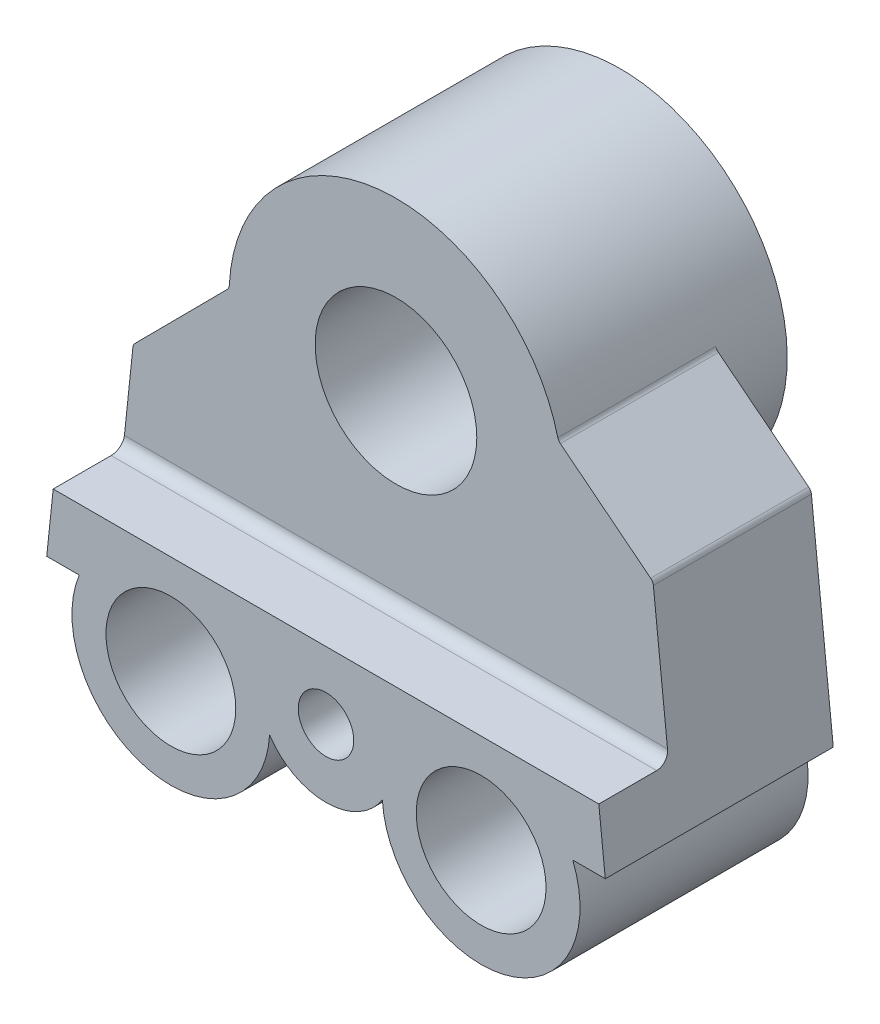
ISO-10303-21;
HEADER;
FILE_DESCRIPTION(('STEP AP214'),'2;1');
FILE_NAME('part.step','',(''),(''),'','','');
FILE_SCHEMA(('AUTOMOTIVE_DESIGN { 1 0 10303 214 1 1 1 1 }'));
ENDSEC;
DATA;
#1=APPLICATION_CONTEXT('core data for automotive mechanical design processes');
#2=APPLICATION_PROTOCOL_DEFINITION('international standard','automotive_design',2000,#1);
#3=PRODUCT_CONTEXT('',#1,'mechanical');
#4=PRODUCT('Part','Part','',(#3));
#5=PRODUCT_RELATED_PRODUCT_CATEGORY('part','',(#4));
#6=PRODUCT_DEFINITION_FORMATION('','',#4);
#7=PRODUCT_DEFINITION_CONTEXT('part definition',#1,'design');
#8=PRODUCT_DEFINITION('design','',#6,#7);
#9=PRODUCT_DEFINITION_SHAPE('','',#8);
#10=(LENGTH_UNIT() NAMED_UNIT(*) SI_UNIT(.MILLI.,.METRE.));
#11=(NAMED_UNIT(*) PLANE_ANGLE_UNIT() SI_UNIT($,.RADIAN.));
#12=(NAMED_UNIT(*) SI_UNIT($,.STERADIAN.) SOLID_ANGLE_UNIT());
#13=UNCERTAINTY_MEASURE_WITH_UNIT(LENGTH_MEASURE(1.E-05),#10,'distance_accuracy_value','');
#14=(GEOMETRIC_REPRESENTATION_CONTEXT(3) GLOBAL_UNCERTAINTY_ASSIGNED_CONTEXT((#13)) GLOBAL_UNIT_ASSIGNED_CONTEXT((#10,
#11,#12)) REPRESENTATION_CONTEXT('',''));
#15=CARTESIAN_POINT('',(0.,0.,0.));
#16=DIRECTION('',(0.,0.,1.));
#17=DIRECTION('',(1.,0.,0.));
#18=AXIS2_PLACEMENT_3D('',#15,#16,#17);
#19=CARTESIAN_POINT('',(0.,0.,-5.5));
#20=DIRECTION('',(0.,0.,1.));
#21=DIRECTION('',(1.,0.,0.));
#22=AXIS2_PLACEMENT_3D('',#19,#20,#21);
#23=CYLINDRICAL_SURFACE('',#22,6.915);
#24=CARTESIAN_POINT('',(0.,0.,-2.75));
#25=DIRECTION('',(0.,0.,1.));
#26=DIRECTION('',(-1.,0.,0.));
#27=AXIS2_PLACEMENT_3D('',#24,#25,#26);
#28=CIRCLE('',#27,6.915);
#29=CARTESIAN_POINT('',(5.31157211435845,-4.42768863787526,-2.75));
#30=VERTEX_POINT('',#29);
#31=CARTESIAN_POINT('',(6.70883660563324,1.67592851843848,-2.75));
#32=VERTEX_POINT('',#31);
#33=EDGE_CURVE('E285',#30,#32,#28,.T.);
#34=ORIENTED_EDGE('',*,*,#33,.F.);
#35=DIRECTION('',(0.,0.,1.));
#36=VECTOR('',#35,1.);
#37=CARTESIAN_POINT('',(5.31157211435845,-4.42768863787526,-5.5));
#38=LINE('',#37,#36);
#39=CARTESIAN_POINT('',(5.31157211435845,-4.42768863787526,-5.5));
#40=VERTEX_POINT('',#39);
#41=EDGE_CURVE('E212',#40,#30,#38,.T.);
#42=ORIENTED_EDGE('',*,*,#41,.F.);
#43=CARTESIAN_POINT('',(0.,0.,-5.5));
#44=DIRECTION('',(0.,0.,1.));
#45=DIRECTION('',(1.,0.,0.));
#46=AXIS2_PLACEMENT_3D('',#43,#44,#45);
#47=CIRCLE('',#46,6.915);
#48=CARTESIAN_POINT('',(-5.31157211435845,-4.42768863787527,-5.5));
#49=VERTEX_POINT('',#48);
#50=EDGE_CURVE('E374',#40,#49,#47,.T.);
#51=ORIENTED_EDGE('',*,*,#50,.T.);
#52=DIRECTION('',(0.,0.,1.));
#53=VECTOR('',#52,1.);
#54=CARTESIAN_POINT('',(-5.31157211435845,-4.42768863787527,-5.5));
#55=LINE('',#54,#53);
#56=CARTESIAN_POINT('',(-5.31157211435845,-4.42768863787527,-2.75));
#57=VERTEX_POINT('',#56);
#58=EDGE_CURVE('E239',#49,#57,#55,.T.);
#59=ORIENTED_EDGE('',*,*,#58,.T.);
#60=CARTESIAN_POINT('',(-6.90652767618571,0.342199441964404,-2.75));
#61=VERTEX_POINT('',#60);
#62=EDGE_CURVE('E286',#61,#57,#28,.T.);
#63=ORIENTED_EDGE('',*,*,#62,.F.);
#64=DIRECTION('',(0.,0.,1.));
#65=VECTOR('',#64,1.);
#66=CARTESIAN_POINT('',(-6.90652767618571,0.342199441964404,-5.5));
#67=LINE('',#66,#65);
#68=CARTESIAN_POINT('',(-6.90652767618571,0.342199441964404,3.8));
#69=VERTEX_POINT('',#68);
#70=EDGE_CURVE('E463',#61,#69,#67,.T.);
#71=ORIENTED_EDGE('',*,*,#70,.T.);
#72=CARTESIAN_POINT('',(0.,0.,3.8));
#73=DIRECTION('',(0.,0.,1.));
#74=DIRECTION('',(1.,0.,0.));
#75=AXIS2_PLACEMENT_3D('',#72,#73,#74);
#76=CIRCLE('',#75,6.915);
#77=CARTESIAN_POINT('',(6.70883660563324,1.67592851843848,3.8));
#78=VERTEX_POINT('',#77);
#79=EDGE_CURVE('E316',#78,#69,#76,.T.);
#80=ORIENTED_EDGE('',*,*,#79,.F.);
#81=DIRECTION('',(0.,0.,1.));
#82=VECTOR('',#81,1.);
#83=CARTESIAN_POINT('',(6.70883660563324,1.67592851843848,-5.5));
#84=LINE('',#83,#82);
#85=EDGE_CURVE('E440',#78,#32,#84,.F.);
#86=ORIENTED_EDGE('',*,*,#85,.T.);
#87=EDGE_LOOP('',(#34,#42,#51,#59,#63,#71,#80,#86));
#88=FACE_BOUND('',#87,.T.);
#89=ADVANCED_FACE('F39',(#88),#23,.T.);
#90=CARTESIAN_POINT('',(-4.42768863787527,-5.31157211435844,-5.5));
#91=VERTEX_POINT('',#90);
#92=CARTESIAN_POINT('',(4.42768863787527,-5.31157211435844,-5.5));
#93=VERTEX_POINT('',#92);
#94=EDGE_CURVE('E375',#91,#93,#47,.T.);
#95=ORIENTED_EDGE('',*,*,#94,.T.);
#96=DIRECTION('',(0.,0.,1.));
#97=VECTOR('',#96,1.);
#98=CARTESIAN_POINT('',(4.42768863787527,-5.31157211435844,-5.5));
#99=LINE('',#98,#97);
#100=CARTESIAN_POINT('',(4.42768863787527,-5.31157211435844,-2.75));
#101=VERTEX_POINT('',#100);
#102=EDGE_CURVE('E224',#93,#101,#99,.T.);
#103=ORIENTED_EDGE('',*,*,#102,.T.);
#104=CARTESIAN_POINT('',(-4.42768863787527,-5.31157211435845,-2.75));
#105=VERTEX_POINT('',#104);
#106=EDGE_CURVE('E291',#105,#101,#28,.T.);
#107=ORIENTED_EDGE('',*,*,#106,.F.);
#108=DIRECTION('',(0.,0.,1.));
#109=VECTOR('',#108,1.);
#110=CARTESIAN_POINT('',(-4.42768863787527,-5.31157211435845,-5.5));
#111=LINE('',#110,#109);
#112=EDGE_CURVE('E243',#91,#105,#111,.T.);
#113=ORIENTED_EDGE('',*,*,#112,.F.);
#114=EDGE_LOOP('',(#95,#103,#107,#113));
#115=FACE_BOUND('',#114,.T.);
#116=ADVANCED_FACE('F562',(#115),#23,.T.);
#117=CARTESIAN_POINT('',(0.,0.,-2.75));
#118=DIRECTION('',(0.,0.,-1.));
#119=DIRECTION('',(-1.,0.,0.));
#120=AXIS2_PLACEMENT_3D('',#117,#118,#119);
#121=PLANE('',#120);
#122=CARTESIAN_POINT('',(0.,-10.525,-2.75));
#123=DIRECTION('',(0.,0.,-1.));
#124=DIRECTION('',(-1.,0.,0.));
#125=AXIS2_PLACEMENT_3D('',#122,#123,#124);
#126=CIRCLE('',#125,1.15);
#127=CARTESIAN_POINT('',(-1.15,-10.525,-2.75));
#128=VERTEX_POINT('',#127);
#129=EDGE_CURVE('E297',#128,#128,#126,.F.);
#130=ORIENTED_EDGE('',*,*,#129,.T.);
#131=EDGE_LOOP('',(#130));
#132=FACE_BOUND('',#131,.T.);
#133=CARTESIAN_POINT('',(6.43,-11.825,-2.75));
#134=DIRECTION('',(0.,0.,-1.));
#135=DIRECTION('',(-1.,0.,0.));
#136=AXIS2_PLACEMENT_3D('',#133,#134,#135);
#137=CIRCLE('',#136,1.325);
#138=CARTESIAN_POINT('',(5.105,-11.825,-2.75));
#139=VERTEX_POINT('',#138);
#140=EDGE_CURVE('E251',#139,#139,#137,.T.);
#141=ORIENTED_EDGE('',*,*,#140,.F.);
#142=EDGE_LOOP('',(#141));
#143=FACE_BOUND('',#142,.T.);
#144=CARTESIAN_POINT('',(-6.43,-11.825,-2.75));
#145=DIRECTION('',(0.,0.,-1.));
#146=DIRECTION('',(-1.,0.,0.));
#147=AXIS2_PLACEMENT_3D('',#144,#145,#146);
#148=CIRCLE('',#147,1.325);
#149=CARTESIAN_POINT('',(-7.755,-11.825,-2.75));
#150=VERTEX_POINT('',#149);
#151=EDGE_CURVE('E246',#150,#150,#148,.T.);
#152=ORIENTED_EDGE('',*,*,#151,.F.);
#153=EDGE_LOOP('',(#152));
#154=FACE_BOUND('',#153,.T.);
#155=DIRECTION('',(-0.707106781186547,-0.707106781186547,0.));
#156=VECTOR('',#155,1.);
#157=CARTESIAN_POINT('',(7.71807051665117,-7.71807051665117,-2.75));
#158=LINE('',#157,#156);
#159=CARTESIAN_POINT('',(8.16001225489276,-7.27612877840957,-2.75));
#160=VERTEX_POINT('',#159);
#161=CARTESIAN_POINT('',(7.27612877840957,-8.16001225489276,-2.75));
#162=VERTEX_POINT('',#161);
#163=EDGE_CURVE('E55',#160,#162,#158,.T.);
#164=ORIENTED_EDGE('',*,*,#163,.F.);
#165=DIRECTION('',(0.707106781186547,-0.707106781186548,0.));
#166=VECTOR('',#165,1.);
#167=CARTESIAN_POINT('',(8.16001225489276,-7.27612877840957,-2.75));
#168=LINE('',#167,#166);
#169=EDGE_CURVE('E62',#30,#160,#168,.T.);
#170=ORIENTED_EDGE('',*,*,#169,.F.);
#171=ORIENTED_EDGE('',*,*,#33,.T.);
#172=CARTESIAN_POINT('',(6.99989242366506,1.74863691403234,-2.75));
#173=DIRECTION('',(0.,0.,-1.));
#174=DIRECTION('',(-1.,0.,0.));
#175=AXIS2_PLACEMENT_3D('',#172,#173,#174);
#176=CIRCLE('',#175,0.3);
#177=CARTESIAN_POINT('',(6.81385226251482,1.51328811238,-2.75));
#178=VERTEX_POINT('',#177);
#179=EDGE_CURVE('E447',#32,#178,#176,.F.);
#180=ORIENTED_EDGE('',*,*,#179,.T.);
#181=DIRECTION('',(0.784496005507815,-0.620133870500783,0.));
#182=VECTOR('',#181,1.);
#183=CARTESIAN_POINT('',(10.6551495232446,-1.5232073207592,-2.75));
#184=LINE('',#183,#182);
#185=CARTESIAN_POINT('',(10.556038895697,-1.44486166107786,-2.75));
#186=VERTEX_POINT('',#185);
#187=EDGE_CURVE('E290',#178,#186,#184,.T.);
#188=ORIENTED_EDGE('',*,*,#187,.T.);
#189=CARTESIAN_POINT('',(10.3699987345467,-1.68021046273021,-2.75));
#190=DIRECTION('',(0.,0.,-1.));
#191=DIRECTION('',(-1.,0.,0.));
#192=AXIS2_PLACEMENT_3D('',#189,#190,#191);
#193=CIRCLE('',#192,0.3);
#194=CARTESIAN_POINT('',(10.6683553031572,-1.64885192374991,-2.75));
#195=VERTEX_POINT('',#194);
#196=EDGE_CURVE('E433',#186,#195,#193,.T.);
#197=ORIENTED_EDGE('',*,*,#196,.T.);
#198=DIRECTION('',(0.104528463267658,-0.994521895368273,0.));
#199=VECTOR('',#198,1.);
#200=CARTESIAN_POINT('',(11.3069842000725,-7.725,-2.75));
#201=LINE('',#200,#199);
#202=CARTESIAN_POINT('',(11.575,-10.275,-2.75));
#203=VERTEX_POINT('',#202);
#204=EDGE_CURVE('E294',#195,#203,#201,.T.);
#205=ORIENTED_EDGE('',*,*,#204,.T.);
#206=DIRECTION('',(-1.,0.,0.));
#207=VECTOR('',#206,1.);
#208=CARTESIAN_POINT('',(10.225721275331,-10.275,-2.75));
#209=LINE('',#208,#207);
#210=CARTESIAN_POINT('',(10.225721275331,-10.275,-2.75));
#211=VERTEX_POINT('',#210);
#212=EDGE_CURVE('E259',#203,#211,#209,.T.);
#213=ORIENTED_EDGE('',*,*,#212,.T.);
#214=CARTESIAN_POINT('',(6.43,-11.825,-2.75));
#215=DIRECTION('',(0.,0.,-1.));
#216=DIRECTION('',(-1.,0.,0.));
#217=AXIS2_PLACEMENT_3D('',#214,#215,#216);
#218=CIRCLE('',#217,4.1);
#219=CARTESIAN_POINT('',(2.33714773158835,-12.0669923737592,-2.75));
#220=VERTEX_POINT('',#219);
#221=EDGE_CURVE('E265',#211,#220,#218,.T.);
#222=ORIENTED_EDGE('',*,*,#221,.T.);
#223=CARTESIAN_POINT('',(0.,-10.525,-2.75));
#224=DIRECTION('',(0.,0.,-1.));
#225=DIRECTION('',(-1.,0.,0.));
#226=AXIS2_PLACEMENT_3D('',#223,#224,#225);
#227=CIRCLE('',#226,2.8);
#228=CARTESIAN_POINT('',(-2.33714773158834,-12.0669923737592,-2.75));
#229=VERTEX_POINT('',#228);
#230=EDGE_CURVE('E268',#220,#229,#227,.T.);
#231=ORIENTED_EDGE('',*,*,#230,.T.);
#232=CARTESIAN_POINT('',(-6.43,-11.825,-2.75));
#233=DIRECTION('',(0.,0.,-1.));
#234=DIRECTION('',(-1.,0.,0.));
#235=AXIS2_PLACEMENT_3D('',#232,#233,#234);
#236=CIRCLE('',#235,4.1);
#237=CARTESIAN_POINT('',(-10.2257212753309,-10.275,-2.75));
#238=VERTEX_POINT('',#237);
#239=EDGE_CURVE('E271',#229,#238,#236,.T.);
#240=ORIENTED_EDGE('',*,*,#239,.T.);
#241=DIRECTION('',(-1.,0.,0.));
#242=VECTOR('',#241,1.);
#243=CARTESIAN_POINT('',(-11.575,-10.275,-2.75));
#244=LINE('',#243,#242);
#245=CARTESIAN_POINT('',(-11.575,-10.275,-2.75));
#246=VERTEX_POINT('',#245);
#247=EDGE_CURVE('E274',#238,#246,#244,.T.);
#248=ORIENTED_EDGE('',*,*,#247,.T.);
#249=DIRECTION('',(0.104528463267657,0.994521895368273,0.));
#250=VECTOR('',#249,1.);
#251=CARTESIAN_POINT('',(-11.3069842000725,-7.725,-2.75));
#252=LINE('',#251,#250);
#253=CARTESIAN_POINT('',(-10.9034722862645,-3.88584059040991,-2.75));
#254=VERTEX_POINT('',#253);
#255=EDGE_CURVE('E277',#246,#254,#252,.T.);
#256=ORIENTED_EDGE('',*,*,#255,.T.);
#257=CARTESIAN_POINT('',(-10.605115717654,-3.91719912939021,-2.75));
#258=DIRECTION('',(0.,0.,-1.));
#259=DIRECTION('',(-1.,0.,0.));
#260=AXIS2_PLACEMENT_3D('',#257,#258,#259);
#261=CIRCLE('',#260,0.3);
#262=CARTESIAN_POINT('',(-10.8179861398051,-3.70580806199797,-2.75));
#263=VERTEX_POINT('',#262);
#264=EDGE_CURVE('E460',#254,#263,#261,.T.);
#265=ORIENTED_EDGE('',*,*,#264,.T.);
#266=DIRECTION('',(0.704636891307447,0.709568073836878,0.));
#267=VECTOR('',#266,1.);
#268=CARTESIAN_POINT('',(-6.91123069897512,0.228287593933185,-2.75));
#269=LINE('',#268,#267);
#270=CARTESIAN_POINT('',(-6.99328969117937,0.145654337347198,-2.75));
#271=VERTEX_POINT('',#270);
#272=EDGE_CURVE('E281',#263,#271,#269,.T.);
#273=ORIENTED_EDGE('',*,*,#272,.T.);
#274=CARTESIAN_POINT('',(-7.20616011333043,0.357045404739432,-2.75));
#275=DIRECTION('',(0.,0.,-1.));
#276=DIRECTION('',(-1.,0.,0.));
#277=AXIS2_PLACEMENT_3D('',#274,#275,#276);
#278=CIRCLE('',#277,0.3);
#279=EDGE_CURVE('E11',#271,#61,#278,.F.);
#280=ORIENTED_EDGE('',*,*,#279,.T.);
#281=ORIENTED_EDGE('',*,*,#62,.T.);
#282=DIRECTION('',(0.707106781186548,0.707106781186547,0.));
#283=VECTOR('',#282,1.);
#284=CARTESIAN_POINT('',(-8.16001225489276,-7.27612877840957,-2.75));
#285=LINE('',#284,#283);
#286=CARTESIAN_POINT('',(-8.16001225489276,-7.27612877840957,-2.75));
#287=VERTEX_POINT('',#286);
#288=EDGE_CURVE('E236',#287,#57,#285,.T.);
#289=ORIENTED_EDGE('',*,*,#288,.F.);
#290=DIRECTION('',(-0.707106781186547,0.707106781186548,0.));
#291=VECTOR('',#290,1.);
#292=CARTESIAN_POINT('',(-7.71807051665119,-7.71807051665114,-2.75));
#293=LINE('',#292,#291);
#294=CARTESIAN_POINT('',(-7.27612877840957,-8.16001225489276,-2.75));
#295=VERTEX_POINT('',#294);
#296=EDGE_CURVE('E233',#295,#287,#293,.T.);
#297=ORIENTED_EDGE('',*,*,#296,.F.);
#298=DIRECTION('',(-0.707106781186547,-0.707106781186548,0.));
#299=VECTOR('',#298,1.);
#300=CARTESIAN_POINT('',(-7.27612877840957,-8.16001225489276,-2.75));
#301=LINE('',#300,#299);
#302=EDGE_CURVE('E229',#105,#295,#301,.T.);
#303=ORIENTED_EDGE('',*,*,#302,.F.);
#304=ORIENTED_EDGE('',*,*,#106,.T.);
#305=DIRECTION('',(-0.707106781186546,0.707106781186549,0.));
#306=VECTOR('',#305,1.);
#307=CARTESIAN_POINT('',(7.27612877840957,-8.16001225489276,-2.75));
#308=LINE('',#307,#306);
#309=EDGE_CURVE('E207',#162,#101,#308,.T.);
#310=ORIENTED_EDGE('',*,*,#309,.F.);
#311=EDGE_LOOP('',(#164,#170,#171,#180,#188,#197,#205,#213,#222,#231,#240,#248,#256,#265,#273,
#280,#281,#289,#297,#303,#304,#310));
#312=FACE_BOUND('',#311,.T.);
#313=ADVANCED_FACE('F204',(#132,#143,#154,#312),#121,.T.);
#314=CARTESIAN_POINT('',(-6.43,-11.825,-5.501));
#315=DIRECTION('',(0.,0.,1.));
#316=DIRECTION('',(1.,0.,0.));
#317=AXIS2_PLACEMENT_3D('',#314,#315,#316);
#318=CYLINDRICAL_SURFACE('',#317,2.69);
#319=CARTESIAN_POINT('',(-6.43,-11.825,6.7));
#320=DIRECTION('',(0.,0.,1.));
#321=DIRECTION('',(1.,0.,0.));
#322=AXIS2_PLACEMENT_3D('',#319,#320,#321);
#323=CIRCLE('',#322,2.69);
#324=CARTESIAN_POINT('',(-3.74,-11.825,6.7));
#325=VERTEX_POINT('',#324);
#326=EDGE_CURVE('E339',#325,#325,#323,.T.);
#327=ORIENTED_EDGE('',*,*,#326,.T.);
#328=EDGE_LOOP('',(#327));
#329=FACE_BOUND('',#328,.T.);
#330=CARTESIAN_POINT('',(-6.43,-11.825,-0.719999999999999));
#331=DIRECTION('',(0.,0.,-1.));
#332=DIRECTION('',(-1.,0.,0.));
#333=AXIS2_PLACEMENT_3D('',#330,#331,#332);
#334=CIRCLE('',#333,2.69);
#335=CARTESIAN_POINT('',(-9.12,-11.825,-0.719999999999999));
#336=VERTEX_POINT('',#335);
#337=EDGE_CURVE('E404',#336,#336,#334,.F.);
#338=ORIENTED_EDGE('',*,*,#337,.F.);
#339=EDGE_LOOP('',(#338));
#340=FACE_BOUND('',#339,.T.);
#341=ADVANCED_FACE('F627',(#329,#340),#318,.F.);
#342=CARTESIAN_POINT('',(6.43,-11.825,-5.501));
#343=DIRECTION('',(0.,0.,1.));
#344=DIRECTION('',(1.,0.,0.));
#345=AXIS2_PLACEMENT_3D('',#342,#343,#344);
#346=CYLINDRICAL_SURFACE('',#345,2.69);
#347=CARTESIAN_POINT('',(6.43,-11.825,6.7));
#348=DIRECTION('',(0.,0.,1.));
#349=DIRECTION('',(1.,0.,0.));
#350=AXIS2_PLACEMENT_3D('',#347,#348,#349);
#351=CIRCLE('',#350,2.69);
#352=CARTESIAN_POINT('',(9.12,-11.825,6.7));
#353=VERTEX_POINT('',#352);
#354=EDGE_CURVE('E330',#353,#353,#351,.T.);
#355=ORIENTED_EDGE('',*,*,#354,.T.);
#356=EDGE_LOOP('',(#355));
#357=FACE_BOUND('',#356,.T.);
#358=CARTESIAN_POINT('',(6.43,-11.825,-0.719999999999999));
#359=DIRECTION('',(0.,0.,-1.));
#360=DIRECTION('',(-1.,0.,0.));
#361=AXIS2_PLACEMENT_3D('',#358,#359,#360);
#362=CIRCLE('',#361,2.69);
#363=CARTESIAN_POINT('',(3.74,-11.825,-0.719999999999999));
#364=VERTEX_POINT('',#363);
#365=EDGE_CURVE('E383',#364,#364,#362,.F.);
#366=ORIENTED_EDGE('',*,*,#365,.F.);
#367=EDGE_LOOP('',(#366));
#368=FACE_BOUND('',#367,.T.);
#369=ADVANCED_FACE('F818',(#357,#368),#346,.F.);
#370=CARTESIAN_POINT('',(10.6551495232446,-1.5232073207592,-5.5));
#371=DIRECTION('',(0.620133870500783,0.784496005507815,0.));
#372=DIRECTION('',(-0.784496005507815,0.620133870500783,0.));
#373=AXIS2_PLACEMENT_3D('',#370,#371,#372);
#374=PLANE('',#373);
#375=ORIENTED_EDGE('',*,*,#187,.F.);
#376=DIRECTION('',(0.,0.,-1.));
#377=VECTOR('',#376,1.);
#378=CARTESIAN_POINT('',(6.81385226251482,1.51328811238,3.8));
#379=LINE('',#378,#377);
#380=CARTESIAN_POINT('',(6.81385226251482,1.51328811238,3.8));
#381=VERTEX_POINT('',#380);
#382=EDGE_CURVE('E436',#178,#381,#379,.F.);
#383=ORIENTED_EDGE('',*,*,#382,.T.);
#384=DIRECTION('',(0.784496005507815,-0.620133870500783,0.));
#385=VECTOR('',#384,1.);
#386=CARTESIAN_POINT('',(6.73266949570553,1.57746203174472,3.8));
#387=LINE('',#386,#385);
#388=CARTESIAN_POINT('',(10.556038895697,-1.44486166107786,3.8));
#389=VERTEX_POINT('',#388);
#390=EDGE_CURVE('E302',#381,#389,#387,.T.);
#391=ORIENTED_EDGE('',*,*,#390,.T.);
#392=DIRECTION('',(0.,0.,1.));
#393=VECTOR('',#392,1.);
#394=CARTESIAN_POINT('',(10.556038895697,-1.44486166107786,-5.5));
#395=LINE('',#394,#393);
#396=EDGE_CURVE('E429',#389,#186,#395,.F.);
#397=ORIENTED_EDGE('',*,*,#396,.T.);
#398=EDGE_LOOP('',(#375,#383,#391,#397));
#399=FACE_BOUND('',#398,.T.);
#400=ADVANCED_FACE('F514',(#399),#374,.T.);
#401=CARTESIAN_POINT('',(-10.8924291348622,-3.78077202324518,-5.5));
#402=DIRECTION('',(-0.709568073836878,0.704636891307447,0.));
#403=DIRECTION('',(-0.704636891307447,-0.709568073836878,0.));
#404=AXIS2_PLACEMENT_3D('',#401,#402,#403);
#405=PLANE('',#404);
#406=DIRECTION('',(0.704636891307447,0.709568073836878,0.));
#407=VECTOR('',#406,1.);
#408=CARTESIAN_POINT('',(-10.8924291348622,-3.78077202324518,3.8));
#409=LINE('',#408,#407);
#410=CARTESIAN_POINT('',(-10.8179861398051,-3.70580806199797,3.8));
#411=VERTEX_POINT('',#410);
#412=CARTESIAN_POINT('',(-6.99328969117937,0.145654337347199,3.8));
#413=VERTEX_POINT('',#412);
#414=EDGE_CURVE('E312',#411,#413,#409,.T.);
#415=ORIENTED_EDGE('',*,*,#414,.T.);
#416=DIRECTION('',(0.,0.,-1.));
#417=VECTOR('',#416,1.);
#418=CARTESIAN_POINT('',(-6.99328969117937,0.145654337347198,-2.75));
#419=LINE('',#418,#417);
#420=EDGE_CURVE('E467',#413,#271,#419,.T.);
#421=ORIENTED_EDGE('',*,*,#420,.T.);
#422=ORIENTED_EDGE('',*,*,#272,.F.);
#423=DIRECTION('',(0.,0.,1.));
#424=VECTOR('',#423,1.);
#425=CARTESIAN_POINT('',(-10.8179861398051,-3.70580806199797,-5.5));
#426=LINE('',#425,#424);
#427=EDGE_CURVE('E450',#263,#411,#426,.T.);
#428=ORIENTED_EDGE('',*,*,#427,.T.);
#429=EDGE_LOOP('',(#415,#421,#422,#428));
#430=FACE_BOUND('',#429,.T.);
#431=ADVANCED_FACE('F479',(#430),#405,.T.);
#432=CARTESIAN_POINT('',(11.575,-10.275,-5.5));
#433=DIRECTION('',(0.994521895368273,0.104528463267658,0.));
#434=DIRECTION('',(-0.104528463267658,0.994521895368273,0.));
#435=AXIS2_PLACEMENT_3D('',#432,#433,#434);
#436=PLANE('',#435);
#437=ORIENTED_EDGE('',*,*,#204,.F.);
#438=DIRECTION('',(0.,0.,1.));
#439=VECTOR('',#438,1.);
#440=CARTESIAN_POINT('',(10.6683553031572,-1.64885192374991,-5.5));
#441=LINE('',#440,#439);
#442=CARTESIAN_POINT('',(10.6683553031572,-1.64885192374991,3.8));
#443=VERTEX_POINT('',#442);
#444=EDGE_CURVE('E421',#195,#443,#441,.T.);
#445=ORIENTED_EDGE('',*,*,#444,.T.);
#446=DIRECTION('',(0.104528463267658,-0.994521895368273,0.));
#447=VECTOR('',#446,1.);
#448=CARTESIAN_POINT('',(10.6551495232446,-1.5232073207592,3.8));
#449=LINE('',#448,#447);
#450=CARTESIAN_POINT('',(11.2544320824397,-7.225,3.8));
#451=VERTEX_POINT('',#450);
#452=EDGE_CURVE('E305',#443,#451,#449,.T.);
#453=ORIENTED_EDGE('',*,*,#452,.T.);
#454=CARTESIAN_POINT('',(11.2544320824397,-7.225,4.3));
#455=DIRECTION('',(0.994521895368273,0.104528463267658,0.));
#456=DIRECTION('',(0.104528463267658,-0.994521895368273,0.));
#457=AXIS2_PLACEMENT_3D('',#454,#455,#456);
#458=ELLIPSE('',#457,0.502754139781758,0.5);
#459=CARTESIAN_POINT('',(11.3069842000725,-7.725,4.3));
#460=VERTEX_POINT('',#459);
#461=EDGE_CURVE('E415',#451,#460,#458,.F.);
#462=ORIENTED_EDGE('',*,*,#461,.T.);
#463=DIRECTION('',(0.,0.,1.));
#464=VECTOR('',#463,1.);
#465=CARTESIAN_POINT('',(11.3069842000725,-7.725,3.8));
#466=LINE('',#465,#464);
#467=CARTESIAN_POINT('',(11.3069842000725,-7.725,6.7));
#468=VERTEX_POINT('',#467);
#469=EDGE_CURVE('E326',#460,#468,#466,.T.);
#470=ORIENTED_EDGE('',*,*,#469,.T.);
#471=DIRECTION('',(-0.104528463267658,0.994521895368273,0.));
#472=VECTOR('',#471,1.);
#473=CARTESIAN_POINT('',(11.575,-10.275,6.7));
#474=LINE('',#473,#472);
#475=CARTESIAN_POINT('',(11.575,-10.275,6.7));
#476=VERTEX_POINT('',#475);
#477=EDGE_CURVE('E370',#476,#468,#474,.T.);
#478=ORIENTED_EDGE('',*,*,#477,.F.);
#479=DIRECTION('',(0.,0.,1.));
#480=VECTOR('',#479,1.);
#481=CARTESIAN_POINT('',(11.575,-10.275,-5.5));
#482=LINE('',#481,#480);
#483=EDGE_CURVE('E380',#203,#476,#482,.T.);
#484=ORIENTED_EDGE('',*,*,#483,.F.);
#485=EDGE_LOOP('',(#437,#445,#453,#462,#470,#478,#484));
#486=FACE_BOUND('',#485,.T.);
#487=ADVANCED_FACE('F505',(#486),#436,.T.);
#488=CARTESIAN_POINT('',(11.575,-10.275,-5.5));
#489=DIRECTION('',(0.,-1.,0.));
#490=DIRECTION('',(0.,0.,-1.));
#491=AXIS2_PLACEMENT_3D('',#488,#489,#490);
#492=PLANE('',#491);
#493=DIRECTION('',(0.,0.,1.));
#494=VECTOR('',#493,1.);
#495=CARTESIAN_POINT('',(10.225721275331,-10.275,-5.5));
#496=LINE('',#495,#494);
#497=CARTESIAN_POINT('',(10.225721275331,-10.275,6.7));
#498=VERTEX_POINT('',#497);
#499=EDGE_CURVE('E384',#211,#498,#496,.T.);
#500=ORIENTED_EDGE('',*,*,#499,.F.);
#501=ORIENTED_EDGE('',*,*,#212,.F.);
#502=ORIENTED_EDGE('',*,*,#483,.T.);
#503=DIRECTION('',(1.,0.,0.));
#504=VECTOR('',#503,1.);
#505=CARTESIAN_POINT('',(11.575,-10.275,6.7));
#506=LINE('',#505,#504);
#507=EDGE_CURVE('E366',#498,#476,#506,.T.);
#508=ORIENTED_EDGE('',*,*,#507,.F.);
#509=EDGE_LOOP('',(#500,#501,#502,#508));
#510=FACE_BOUND('',#509,.T.);
#511=ADVANCED_FACE('F766',(#510),#492,.T.);
#512=CARTESIAN_POINT('',(6.43,-11.825,-5.5));
#513=DIRECTION('',(0.,0.,1.));
#514=DIRECTION('',(1.,0.,0.));
#515=AXIS2_PLACEMENT_3D('',#512,#513,#514);
#516=CYLINDRICAL_SURFACE('',#515,4.1);
#517=ORIENTED_EDGE('',*,*,#499,.T.);
#518=CARTESIAN_POINT('',(6.43,-11.825,6.7));
#519=DIRECTION('',(0.,0.,1.));
#520=DIRECTION('',(1.,0.,0.));
#521=AXIS2_PLACEMENT_3D('',#518,#519,#520);
#522=CIRCLE('',#521,4.1);
#523=CARTESIAN_POINT('',(2.33714773158835,-12.0669923737592,6.7));
#524=VERTEX_POINT('',#523);
#525=EDGE_CURVE('E362',#524,#498,#522,.T.);
#526=ORIENTED_EDGE('',*,*,#525,.F.);
#527=DIRECTION('',(0.,0.,1.));
#528=VECTOR('',#527,1.);
#529=CARTESIAN_POINT('',(2.33714773158835,-12.0669923737592,-5.5));
#530=LINE('',#529,#528);
#531=EDGE_CURVE('E387',#220,#524,#530,.T.);
#532=ORIENTED_EDGE('',*,*,#531,.F.);
#533=ORIENTED_EDGE('',*,*,#221,.F.);
#534=EDGE_LOOP('',(#517,#526,#532,#533));
#535=FACE_BOUND('',#534,.T.);
#536=ADVANCED_FACE('F772',(#535),#516,.T.);
#537=CARTESIAN_POINT('',(0.,-10.525,-5.5));
#538=DIRECTION('',(0.,0.,1.));
#539=DIRECTION('',(1.,0.,0.));
#540=AXIS2_PLACEMENT_3D('',#537,#538,#539);
#541=CYLINDRICAL_SURFACE('',#540,2.8);
#542=DIRECTION('',(0.,0.,1.));
#543=VECTOR('',#542,1.);
#544=CARTESIAN_POINT('',(-2.33714773158834,-12.0669923737592,-5.5));
#545=LINE('',#544,#543);
#546=CARTESIAN_POINT('',(-2.33714773158834,-12.0669923737592,6.7));
#547=VERTEX_POINT('',#546);
#548=EDGE_CURVE('E390',#229,#547,#545,.T.);
#549=ORIENTED_EDGE('',*,*,#548,.F.);
#550=ORIENTED_EDGE('',*,*,#230,.F.);
#551=ORIENTED_EDGE('',*,*,#531,.T.);
#552=CARTESIAN_POINT('',(0.,-10.525,6.7));
#553=DIRECTION('',(0.,0.,1.));
#554=DIRECTION('',(1.,0.,0.));
#555=AXIS2_PLACEMENT_3D('',#552,#553,#554);
#556=CIRCLE('',#555,2.8);
#557=EDGE_CURVE('E358',#547,#524,#556,.T.);
#558=ORIENTED_EDGE('',*,*,#557,.F.);
#559=EDGE_LOOP('',(#549,#550,#551,#558));
#560=FACE_BOUND('',#559,.T.);
#561=ADVANCED_FACE('F781',(#560),#541,.T.);
#562=CARTESIAN_POINT('',(-6.43,-11.825,-5.5));
#563=DIRECTION('',(0.,0.,1.));
#564=DIRECTION('',(1.,0.,0.));
#565=AXIS2_PLACEMENT_3D('',#562,#563,#564);
#566=CYLINDRICAL_SURFACE('',#565,4.1);
#567=ORIENTED_EDGE('',*,*,#548,.T.);
#568=CARTESIAN_POINT('',(-6.43,-11.825,6.7));
#569=DIRECTION('',(0.,0.,1.));
#570=DIRECTION('',(1.,0.,0.));
#571=AXIS2_PLACEMENT_3D('',#568,#569,#570);
#572=CIRCLE('',#571,4.1);
#573=CARTESIAN_POINT('',(-10.2257212753309,-10.275,6.7));
#574=VERTEX_POINT('',#573);
#575=EDGE_CURVE('E354',#574,#547,#572,.T.);
#576=ORIENTED_EDGE('',*,*,#575,.F.);
#577=DIRECTION('',(0.,0.,1.));
#578=VECTOR('',#577,1.);
#579=CARTESIAN_POINT('',(-10.2257212753309,-10.275,-5.5));
#580=LINE('',#579,#578);
#581=EDGE_CURVE('E393',#238,#574,#580,.T.);
#582=ORIENTED_EDGE('',*,*,#581,.F.);
#583=ORIENTED_EDGE('',*,*,#239,.F.);
#584=EDGE_LOOP('',(#567,#576,#582,#583));
#585=FACE_BOUND('',#584,.T.);
#586=ADVANCED_FACE('F789',(#585),#566,.T.);
#587=CARTESIAN_POINT('',(-11.575,-10.275,-5.5));
#588=DIRECTION('',(0.,-1.,0.));
#589=DIRECTION('',(0.,0.,-1.));
#590=AXIS2_PLACEMENT_3D('',#587,#588,#589);
#591=PLANE('',#590);
#592=DIRECTION('',(0.,0.,1.));
#593=VECTOR('',#592,1.);
#594=CARTESIAN_POINT('',(-11.575,-10.275,-5.5));
#595=LINE('',#594,#593);
#596=CARTESIAN_POINT('',(-11.575,-10.275,6.7));
#597=VERTEX_POINT('',#596);
#598=EDGE_CURVE('E379',#246,#597,#595,.T.);
#599=ORIENTED_EDGE('',*,*,#598,.F.);
#600=ORIENTED_EDGE('',*,*,#247,.F.);
#601=ORIENTED_EDGE('',*,*,#581,.T.);
#602=DIRECTION('',(1.,0.,0.));
#603=VECTOR('',#602,1.);
#604=CARTESIAN_POINT('',(-11.575,-10.275,6.7));
#605=LINE('',#604,#603);
#606=EDGE_CURVE('E350',#597,#574,#605,.T.);
#607=ORIENTED_EDGE('',*,*,#606,.F.);
#608=EDGE_LOOP('',(#599,#600,#601,#607));
#609=FACE_BOUND('',#608,.T.);
#610=ADVANCED_FACE('F744',(#609),#591,.T.);
#611=CARTESIAN_POINT('',(-11.575,-10.275,-5.5));
#612=DIRECTION('',(-0.994521895368273,0.104528463267657,0.));
#613=DIRECTION('',(-0.104528463267657,-0.994521895368273,0.));
#614=AXIS2_PLACEMENT_3D('',#611,#612,#613);
#615=PLANE('',#614);
#616=DIRECTION('',(0.104528463267657,0.994521895368273,0.));
#617=VECTOR('',#616,1.);
#618=CARTESIAN_POINT('',(-11.3069842000725,-7.725,3.8));
#619=LINE('',#618,#617);
#620=CARTESIAN_POINT('',(-11.2544320824397,-7.225,3.8));
#621=VERTEX_POINT('',#620);
#622=CARTESIAN_POINT('',(-10.9034722862645,-3.88584059040991,3.8));
#623=VERTEX_POINT('',#622);
#624=EDGE_CURVE('E308',#621,#623,#619,.T.);
#625=ORIENTED_EDGE('',*,*,#624,.T.);
#626=DIRECTION('',(0.,0.,1.));
#627=VECTOR('',#626,1.);
#628=CARTESIAN_POINT('',(-10.9034722862645,-3.88584059040991,-5.5));
#629=LINE('',#628,#627);
#630=EDGE_CURVE('E457',#623,#254,#629,.F.);
#631=ORIENTED_EDGE('',*,*,#630,.T.);
#632=ORIENTED_EDGE('',*,*,#255,.F.);
#633=ORIENTED_EDGE('',*,*,#598,.T.);
#634=DIRECTION('',(-0.104528463267657,-0.994521895368273,0.));
#635=VECTOR('',#634,1.);
#636=CARTESIAN_POINT('',(-11.575,-10.275,6.7));
#637=LINE('',#636,#635);
#638=CARTESIAN_POINT('',(-11.3069842000725,-7.725,6.7));
#639=VERTEX_POINT('',#638);
#640=EDGE_CURVE('E334',#639,#597,#637,.T.);
#641=ORIENTED_EDGE('',*,*,#640,.F.);
#642=DIRECTION('',(0.,0.,1.));
#643=VECTOR('',#642,1.);
#644=CARTESIAN_POINT('',(-11.3069842000725,-7.725,3.8));
#645=LINE('',#644,#643);
#646=CARTESIAN_POINT('',(-11.3069842000725,-7.725,4.3));
#647=VERTEX_POINT('',#646);
#648=EDGE_CURVE('E320',#647,#639,#645,.T.);
#649=ORIENTED_EDGE('',*,*,#648,.F.);
#650=CARTESIAN_POINT('',(-11.2544320824397,-7.225,4.3));
#651=DIRECTION('',(-0.994521895368273,0.104528463267657,0.));
#652=DIRECTION('',(0.104528463267657,0.994521895368273,0.));
#653=AXIS2_PLACEMENT_3D('',#650,#651,#652);
#654=ELLIPSE('',#653,0.502754139781758,0.5);
#655=EDGE_CURVE('E418',#647,#621,#654,.F.);
#656=ORIENTED_EDGE('',*,*,#655,.T.);
#657=EDGE_LOOP('',(#625,#631,#632,#633,#641,#649,#656));
#658=FACE_BOUND('',#657,.T.);
#659=ADVANCED_FACE('F491',(#658),#615,.T.);
#660=CARTESIAN_POINT('',(0.,-10.525,-5.501));
#661=DIRECTION('',(0.,0.,1.));
#662=DIRECTION('',(1.,0.,0.));
#663=AXIS2_PLACEMENT_3D('',#660,#661,#662);
#664=CYLINDRICAL_SURFACE('',#663,1.15);
#665=CARTESIAN_POINT('',(0.,-10.525,6.7));
#666=DIRECTION('',(0.,0.,1.));
#667=DIRECTION('',(1.,0.,0.));
#668=AXIS2_PLACEMENT_3D('',#665,#666,#667);
#669=CIRCLE('',#668,1.15);
#670=CARTESIAN_POINT('',(1.15,-10.525,6.7));
#671=VERTEX_POINT('',#670);
#672=EDGE_CURVE('E335',#671,#671,#669,.T.);
#673=ORIENTED_EDGE('',*,*,#672,.T.);
#674=EDGE_LOOP('',(#673));
#675=FACE_BOUND('',#674,.T.);
#676=ORIENTED_EDGE('',*,*,#129,.F.);
#677=EDGE_LOOP('',(#676));
#678=FACE_BOUND('',#677,.T.);
#679=ADVANCED_FACE('F743',(#675,#678),#664,.F.);
#680=CARTESIAN_POINT('',(0.,0.,-5.501));
#681=DIRECTION('',(0.,0.,1.));
#682=DIRECTION('',(1.,0.,0.));
#683=AXIS2_PLACEMENT_3D('',#680,#681,#682);
#684=CYLINDRICAL_SURFACE('',#683,3.35);
#685=CARTESIAN_POINT('',(0.,0.,-5.5));
#686=DIRECTION('',(0.,0.,1.));
#687=DIRECTION('',(1.,0.,0.));
#688=AXIS2_PLACEMENT_3D('',#685,#686,#687);
#689=CIRCLE('',#688,3.35);
#690=CARTESIAN_POINT('',(3.35,0.,-5.5));
#691=VERTEX_POINT('',#690);
#692=EDGE_CURVE('E343',#691,#691,#689,.F.);
#693=ORIENTED_EDGE('',*,*,#692,.T.);
#694=EDGE_LOOP('',(#693));
#695=FACE_BOUND('',#694,.T.);
#696=CARTESIAN_POINT('',(0.,0.,3.8));
#697=DIRECTION('',(0.,0.,1.));
#698=DIRECTION('',(1.,0.,0.));
#699=AXIS2_PLACEMENT_3D('',#696,#697,#698);
#700=CIRCLE('',#699,3.35);
#701=CARTESIAN_POINT('',(3.35,0.,3.8));
#702=VERTEX_POINT('',#701);
#703=EDGE_CURVE('E329',#702,#702,#700,.F.);
#704=ORIENTED_EDGE('',*,*,#703,.F.);
#705=EDGE_LOOP('',(#704));
#706=FACE_BOUND('',#705,.T.);
#707=ADVANCED_FACE('F639',(#695,#706),#684,.F.);
#708=CARTESIAN_POINT('',(0.,0.,-5.5));
#709=DIRECTION('',(0.,0.,1.));
#710=DIRECTION('',(1.,0.,0.));
#711=AXIS2_PLACEMENT_3D('',#708,#709,#710);
#712=PLANE('',#711);
#713=ORIENTED_EDGE('',*,*,#692,.F.);
#714=EDGE_LOOP('',(#713));
#715=FACE_BOUND('',#714,.T.);
#716=ORIENTED_EDGE('',*,*,#50,.F.);
#717=DIRECTION('',(0.707106781186548,0.707106781186547,0.));
#718=VECTOR('',#717,1.);
#719=CARTESIAN_POINT('',(-8.88136962388315,-18.6206303761169,-5.5));
#720=LINE('',#719,#718);
#721=EDGE_CURVE('E196',#93,#40,#720,.T.);
#722=ORIENTED_EDGE('',*,*,#721,.F.);
#723=ORIENTED_EDGE('',*,*,#94,.F.);
#724=DIRECTION('',(-0.707106781186547,0.707106781186548,0.));
#725=VECTOR('',#724,1.);
#726=CARTESIAN_POINT('',(8.88136962388314,-18.6206303761169,-5.5));
#727=LINE('',#726,#725);
#728=EDGE_CURVE('E214',#91,#49,#727,.T.);
#729=ORIENTED_EDGE('',*,*,#728,.T.);
#730=EDGE_LOOP('',(#716,#722,#723,#729));
#731=FACE_BOUND('',#730,.T.);
#732=ADVANCED_FACE('F548',(#715,#731),#712,.F.);
#733=CARTESIAN_POINT('',(0.,0.,6.7));
#734=DIRECTION('',(0.,0.,1.));
#735=DIRECTION('',(1.,0.,0.));
#736=AXIS2_PLACEMENT_3D('',#733,#734,#735);
#737=PLANE('',#736);
#738=DIRECTION('',(1.,0.,0.));
#739=VECTOR('',#738,1.);
#740=CARTESIAN_POINT('',(-11.3069842000725,-7.725,6.7));
#741=LINE('',#740,#739);
#742=EDGE_CURVE('E301',#639,#468,#741,.T.);
#743=ORIENTED_EDGE('',*,*,#742,.F.);
#744=ORIENTED_EDGE('',*,*,#640,.T.);
#745=ORIENTED_EDGE('',*,*,#606,.T.);
#746=ORIENTED_EDGE('',*,*,#575,.T.);
#747=ORIENTED_EDGE('',*,*,#557,.T.);
#748=ORIENTED_EDGE('',*,*,#525,.T.);
#749=ORIENTED_EDGE('',*,*,#507,.T.);
#750=ORIENTED_EDGE('',*,*,#477,.T.);
#751=EDGE_LOOP('',(#743,#744,#745,#746,#747,#748,#749,#750));
#752=FACE_BOUND('',#751,.T.);
#753=ORIENTED_EDGE('',*,*,#354,.F.);
#754=EDGE_LOOP('',(#753));
#755=FACE_BOUND('',#754,.T.);
#756=ORIENTED_EDGE('',*,*,#672,.F.);
#757=EDGE_LOOP('',(#756));
#758=FACE_BOUND('',#757,.T.);
#759=ORIENTED_EDGE('',*,*,#326,.F.);
#760=EDGE_LOOP('',(#759));
#761=FACE_BOUND('',#760,.T.);
#762=ADVANCED_FACE('F638',(#752,#755,#758,#761),#737,.T.);
#763=CARTESIAN_POINT('',(0.,0.,3.8));
#764=DIRECTION('',(0.,0.,1.));
#765=DIRECTION('',(1.,0.,0.));
#766=AXIS2_PLACEMENT_3D('',#763,#764,#765);
#767=PLANE('',#766);
#768=ORIENTED_EDGE('',*,*,#414,.F.);
#769=CARTESIAN_POINT('',(-10.605115717654,-3.91719912939021,3.8));
#770=DIRECTION('',(0.,0.,1.));
#771=DIRECTION('',(1.,0.,0.));
#772=AXIS2_PLACEMENT_3D('',#769,#770,#771);
#773=CIRCLE('',#772,0.3);
#774=EDGE_CURVE('E454',#411,#623,#773,.T.);
#775=ORIENTED_EDGE('',*,*,#774,.T.);
#776=ORIENTED_EDGE('',*,*,#624,.F.);
#777=DIRECTION('',(1.,0.,0.));
#778=VECTOR('',#777,1.);
#779=CARTESIAN_POINT('',(0.,-7.225,3.8));
#780=LINE('',#779,#778);
#781=EDGE_CURVE('E408',#621,#451,#780,.T.);
#782=ORIENTED_EDGE('',*,*,#781,.T.);
#783=ORIENTED_EDGE('',*,*,#452,.F.);
#784=CARTESIAN_POINT('',(10.3699987345467,-1.68021046273021,3.8));
#785=DIRECTION('',(0.,0.,1.));
#786=DIRECTION('',(1.,0.,0.));
#787=AXIS2_PLACEMENT_3D('',#784,#785,#786);
#788=CIRCLE('',#787,0.3);
#789=EDGE_CURVE('E425',#443,#389,#788,.T.);
#790=ORIENTED_EDGE('',*,*,#789,.T.);
#791=ORIENTED_EDGE('',*,*,#390,.F.);
#792=CARTESIAN_POINT('',(6.99989242366506,1.74863691403234,3.8));
#793=DIRECTION('',(0.,0.,1.));
#794=DIRECTION('',(1.,0.,0.));
#795=AXIS2_PLACEMENT_3D('',#792,#793,#794);
#796=CIRCLE('',#795,0.3);
#797=EDGE_CURVE('E444',#381,#78,#796,.F.);
#798=ORIENTED_EDGE('',*,*,#797,.T.);
#799=ORIENTED_EDGE('',*,*,#79,.T.);
#800=CARTESIAN_POINT('',(-7.20616011333043,0.357045404739432,3.8));
#801=DIRECTION('',(0.,0.,1.));
#802=DIRECTION('',(1.,0.,0.));
#803=AXIS2_PLACEMENT_3D('',#800,#801,#802);
#804=CIRCLE('',#803,0.3);
#805=EDGE_CURVE('E48',#69,#413,#804,.F.);
#806=ORIENTED_EDGE('',*,*,#805,.T.);
#807=EDGE_LOOP('',(#768,#775,#776,#782,#783,#790,#791,#798,#799,#806));
#808=FACE_BOUND('',#807,.T.);
#809=ORIENTED_EDGE('',*,*,#703,.T.);
#810=EDGE_LOOP('',(#809));
#811=FACE_BOUND('',#810,.T.);
#812=ADVANCED_FACE('F472',(#808,#811),#767,.T.);
#813=CARTESIAN_POINT('',(-11.3069842000725,-7.725,3.8));
#814=DIRECTION('',(0.,-1.,0.));
#815=DIRECTION('',(1.,0.,0.));
#816=AXIS2_PLACEMENT_3D('',#813,#814,#815);
#817=PLANE('',#816);
#818=ORIENTED_EDGE('',*,*,#469,.F.);
#819=DIRECTION('',(1.,0.,0.));
#820=VECTOR('',#819,1.);
#821=CARTESIAN_POINT('',(-11.3069842000725,-7.725,4.3));
#822=LINE('',#821,#820);
#823=EDGE_CURVE('E412',#460,#647,#822,.F.);
#824=ORIENTED_EDGE('',*,*,#823,.T.);
#825=ORIENTED_EDGE('',*,*,#648,.T.);
#826=ORIENTED_EDGE('',*,*,#742,.T.);
#827=EDGE_LOOP('',(#818,#824,#825,#826));
#828=FACE_BOUND('',#827,.T.);
#829=ADVANCED_FACE('F676',(#828),#817,.F.);
#830=CARTESIAN_POINT('',(6.43,-11.825,-0.72));
#831=DIRECTION('',(0.,0.,-1.));
#832=DIRECTION('',(-1.,0.,0.));
#833=AXIS2_PLACEMENT_3D('',#830,#831,#832);
#834=PLANE('',#833);
#835=CARTESIAN_POINT('',(6.43,-11.825,-0.72));
#836=DIRECTION('',(0.,0.,-1.));
#837=DIRECTION('',(-1.,0.,0.));
#838=AXIS2_PLACEMENT_3D('',#835,#836,#837);
#839=CIRCLE('',#838,1.325);
#840=CARTESIAN_POINT('',(5.105,-11.825,-0.72));
#841=VERTEX_POINT('',#840);
#842=EDGE_CURVE('E255',#841,#841,#839,.T.);
#843=ORIENTED_EDGE('',*,*,#842,.T.);
#844=EDGE_LOOP('',(#843));
#845=FACE_BOUND('',#844,.T.);
#846=ORIENTED_EDGE('',*,*,#365,.T.);
#847=EDGE_LOOP('',(#846));
#848=FACE_BOUND('',#847,.T.);
#849=ADVANCED_FACE('F684',(#845,#848),#834,.F.);
#850=CARTESIAN_POINT('',(6.43,-11.825,-0.72));
#851=DIRECTION('',(0.,0.,-1.));
#852=DIRECTION('',(-1.,0.,0.));
#853=AXIS2_PLACEMENT_3D('',#850,#851,#852);
#854=CYLINDRICAL_SURFACE('',#853,1.325);
#855=ORIENTED_EDGE('',*,*,#842,.F.);
#856=EDGE_LOOP('',(#855));
#857=FACE_BOUND('',#856,.T.);
#858=ORIENTED_EDGE('',*,*,#140,.T.);
#859=EDGE_LOOP('',(#858));
#860=FACE_BOUND('',#859,.T.);
#861=ADVANCED_FACE('F694',(#857,#860),#854,.F.);
#862=CARTESIAN_POINT('',(-6.43,-11.825,-0.72));
#863=DIRECTION('',(0.,0.,-1.));
#864=DIRECTION('',(-1.,0.,0.));
#865=AXIS2_PLACEMENT_3D('',#862,#863,#864);
#866=PLANE('',#865);
#867=CARTESIAN_POINT('',(-6.43,-11.825,-0.72));
#868=DIRECTION('',(0.,0.,-1.));
#869=DIRECTION('',(-1.,0.,0.));
#870=AXIS2_PLACEMENT_3D('',#867,#868,#869);
#871=CIRCLE('',#870,1.325);
#872=CARTESIAN_POINT('',(-7.755,-11.825,-0.72));
#873=VERTEX_POINT('',#872);
#874=EDGE_CURVE('E247',#873,#873,#871,.T.);
#875=ORIENTED_EDGE('',*,*,#874,.T.);
#876=EDGE_LOOP('',(#875));
#877=FACE_BOUND('',#876,.T.);
#878=ORIENTED_EDGE('',*,*,#337,.T.);
#879=EDGE_LOOP('',(#878));
#880=FACE_BOUND('',#879,.T.);
#881=ADVANCED_FACE('F703',(#877,#880),#866,.F.);
#882=CARTESIAN_POINT('',(-6.43,-11.825,-0.72));
#883=DIRECTION('',(0.,0.,-1.));
#884=DIRECTION('',(-1.,0.,0.));
#885=AXIS2_PLACEMENT_3D('',#882,#883,#884);
#886=CYLINDRICAL_SURFACE('',#885,1.325);
#887=ORIENTED_EDGE('',*,*,#874,.F.);
#888=EDGE_LOOP('',(#887));
#889=FACE_BOUND('',#888,.T.);
#890=ORIENTED_EDGE('',*,*,#151,.T.);
#891=EDGE_LOOP('',(#890));
#892=FACE_BOUND('',#891,.T.);
#893=ADVANCED_FACE('F572',(#889,#892),#886,.F.);
#894=CARTESIAN_POINT('',(0.,-7.225,4.3));
#895=DIRECTION('',(1.,0.,0.));
#896=DIRECTION('',(0.,1.,0.));
#897=AXIS2_PLACEMENT_3D('',#894,#895,#896);
#898=CYLINDRICAL_SURFACE('',#897,0.5);
#899=ORIENTED_EDGE('',*,*,#655,.F.);
#900=ORIENTED_EDGE('',*,*,#823,.F.);
#901=ORIENTED_EDGE('',*,*,#461,.F.);
#902=ORIENTED_EDGE('',*,*,#781,.F.);
#903=EDGE_LOOP('',(#899,#900,#901,#902));
#904=FACE_BOUND('',#903,.T.);
#905=ADVANCED_FACE('F498',(#904),#898,.F.);
#906=CARTESIAN_POINT('',(10.3699987345467,-1.68021046273021,-5.5));
#907=DIRECTION('',(0.,0.,1.));
#908=DIRECTION('',(1.,0.,0.));
#909=AXIS2_PLACEMENT_3D('',#906,#907,#908);
#910=CYLINDRICAL_SURFACE('',#909,0.3);
#911=ORIENTED_EDGE('',*,*,#196,.F.);
#912=ORIENTED_EDGE('',*,*,#396,.F.);
#913=ORIENTED_EDGE('',*,*,#789,.F.);
#914=ORIENTED_EDGE('',*,*,#444,.F.);
#915=EDGE_LOOP('',(#911,#912,#913,#914));
#916=FACE_BOUND('',#915,.T.);
#917=ADVANCED_FACE('F511',(#916),#910,.T.);
#918=CARTESIAN_POINT('',(6.99989242366506,1.74863691403234,-5.5));
#919=DIRECTION('',(0.,0.,1.));
#920=DIRECTION('',(1.,0.,0.));
#921=AXIS2_PLACEMENT_3D('',#918,#919,#920);
#922=CYLINDRICAL_SURFACE('',#921,0.3);
#923=ORIENTED_EDGE('',*,*,#179,.F.);
#924=ORIENTED_EDGE('',*,*,#85,.F.);
#925=ORIENTED_EDGE('',*,*,#797,.F.);
#926=ORIENTED_EDGE('',*,*,#382,.F.);
#927=EDGE_LOOP('',(#923,#924,#925,#926));
#928=FACE_BOUND('',#927,.T.);
#929=ADVANCED_FACE('F520',(#928),#922,.F.);
#930=CARTESIAN_POINT('',(-10.605115717654,-3.91719912939021,-5.5));
#931=DIRECTION('',(0.,0.,1.));
#932=DIRECTION('',(1.,0.,0.));
#933=AXIS2_PLACEMENT_3D('',#930,#931,#932);
#934=CYLINDRICAL_SURFACE('',#933,0.3);
#935=ORIENTED_EDGE('',*,*,#264,.F.);
#936=ORIENTED_EDGE('',*,*,#630,.F.);
#937=ORIENTED_EDGE('',*,*,#774,.F.);
#938=ORIENTED_EDGE('',*,*,#427,.F.);
#939=EDGE_LOOP('',(#935,#936,#937,#938));
#940=FACE_BOUND('',#939,.T.);
#941=ADVANCED_FACE('F486',(#940),#934,.T.);
#942=CARTESIAN_POINT('',(-7.20616011333043,0.357045404739432,-5.5));
#943=DIRECTION('',(0.,0.,1.));
#944=DIRECTION('',(1.,0.,0.));
#945=AXIS2_PLACEMENT_3D('',#942,#943,#944);
#946=CYLINDRICAL_SURFACE('',#945,0.3);
#947=ORIENTED_EDGE('',*,*,#279,.F.);
#948=ORIENTED_EDGE('',*,*,#420,.F.);
#949=ORIENTED_EDGE('',*,*,#805,.F.);
#950=ORIENTED_EDGE('',*,*,#70,.F.);
#951=EDGE_LOOP('',(#947,#948,#949,#950));
#952=FACE_BOUND('',#951,.T.);
#953=ADVANCED_FACE('F41',(#952),#946,.F.);
#954=CARTESIAN_POINT('',(-7.27612877840957,-8.16001225489276,-5.5));
#955=DIRECTION('',(-0.707106781186548,0.707106781186547,0.));
#956=DIRECTION('',(-0.707106781186547,-0.707106781186548,0.));
#957=AXIS2_PLACEMENT_3D('',#954,#955,#956);
#958=PLANE('',#957);
#959=ORIENTED_EDGE('',*,*,#302,.T.);
#960=DIRECTION('',(-0.583999411510988,-0.58399941151099,0.563816791794672));
#961=VECTOR('',#960,1.);
#962=CARTESIAN_POINT('',(-4.42768863787528,-5.31157211435846,-5.49999999999999));
#963=LINE('',#962,#961);
#964=EDGE_CURVE('E536',#91,#295,#963,.T.);
#965=ORIENTED_EDGE('',*,*,#964,.F.);
#966=ORIENTED_EDGE('',*,*,#112,.T.);
#967=EDGE_LOOP('',(#959,#965,#966));
#968=FACE_BOUND('',#967,.T.);
#969=ADVANCED_FACE('F552',(#968),#958,.F.);
#970=CARTESIAN_POINT('',(-8.16001225489276,-7.27612877840957,-5.5));
#971=DIRECTION('',(0.707106781186547,-0.707106781186548,0.));
#972=DIRECTION('',(0.707106781186548,0.707106781186547,0.));
#973=AXIS2_PLACEMENT_3D('',#970,#971,#972);
#974=PLANE('',#973);
#975=ORIENTED_EDGE('',*,*,#58,.F.);
#976=DIRECTION('',(0.583999411510989,0.583999411510989,-0.563816791794672));
#977=VECTOR('',#976,1.);
#978=CARTESIAN_POINT('',(-5.31157211435845,-4.42768863787527,-5.5));
#979=LINE('',#978,#977);
#980=EDGE_CURVE('E218',#287,#49,#979,.T.);
#981=ORIENTED_EDGE('',*,*,#980,.F.);
#982=ORIENTED_EDGE('',*,*,#288,.T.);
#983=EDGE_LOOP('',(#975,#981,#982));
#984=FACE_BOUND('',#983,.T.);
#985=ADVANCED_FACE('F550',(#984),#974,.F.);
#986=CARTESIAN_POINT('',(8.16001225489276,-7.27612877840957,-5.5));
#987=DIRECTION('',(-0.707106781186548,-0.707106781186547,0.));
#988=DIRECTION('',(0.707106781186547,-0.707106781186548,0.));
#989=AXIS2_PLACEMENT_3D('',#986,#987,#988);
#990=PLANE('',#989);
#991=ORIENTED_EDGE('',*,*,#169,.T.);
#992=DIRECTION('',(0.583999411510989,-0.583999411510989,0.563816791794672));
#993=VECTOR('',#992,1.);
#994=CARTESIAN_POINT('',(5.31157211435845,-4.42768863787526,-5.5));
#995=LINE('',#994,#993);
#996=EDGE_CURVE('E193',#40,#160,#995,.T.);
#997=ORIENTED_EDGE('',*,*,#996,.F.);
#998=ORIENTED_EDGE('',*,*,#41,.T.);
#999=EDGE_LOOP('',(#991,#997,#998));
#1000=FACE_BOUND('',#999,.T.);
#1001=ADVANCED_FACE('F210',(#1000),#990,.F.);
#1002=CARTESIAN_POINT('',(7.27612877840957,-8.16001225489276,-5.5));
#1003=DIRECTION('',(0.707106781186549,0.707106781186546,0.));
#1004=DIRECTION('',(-0.707106781186546,0.707106781186549,0.));
#1005=AXIS2_PLACEMENT_3D('',#1002,#1003,#1004);
#1006=PLANE('',#1005);
#1007=ORIENTED_EDGE('',*,*,#102,.F.);
#1008=DIRECTION('',(-0.583999411510988,0.58399941151099,-0.563816791794672));
#1009=VECTOR('',#1008,1.);
#1010=CARTESIAN_POINT('',(4.42768863787528,-5.31157211435845,-5.49999999999999));
#1011=LINE('',#1010,#1009);
#1012=EDGE_CURVE('E201',#162,#93,#1011,.T.);
#1013=ORIENTED_EDGE('',*,*,#1012,.F.);
#1014=ORIENTED_EDGE('',*,*,#309,.T.);
#1015=EDGE_LOOP('',(#1007,#1013,#1014));
#1016=FACE_BOUND('',#1015,.T.);
#1017=ADVANCED_FACE('F530',(#1016),#1006,.F.);
#1018=CARTESIAN_POINT('',(8.88136962388314,-18.6206303761169,-5.5));
#1019=DIRECTION('',(0.398678676824857,0.398678676824856,0.825899888176747));
#1020=DIRECTION('',(0.900565132230198,0.,-0.43472110900117));
#1021=AXIS2_PLACEMENT_3D('',#1018,#1019,#1020);
#1022=PLANE('',#1021);
#1023=ORIENTED_EDGE('',*,*,#964,.T.);
#1024=ORIENTED_EDGE('',*,*,#296,.T.);
#1025=ORIENTED_EDGE('',*,*,#980,.T.);
#1026=ORIENTED_EDGE('',*,*,#728,.F.);
#1027=EDGE_LOOP('',(#1023,#1024,#1025,#1026));
#1028=FACE_BOUND('',#1027,.T.);
#1029=ADVANCED_FACE('F541',(#1028),#1022,.F.);
#1030=CARTESIAN_POINT('',(-8.88136962388315,-18.6206303761169,-5.5));
#1031=DIRECTION('',(-0.398678676824856,0.398678676824857,0.825899888176747));
#1032=DIRECTION('',(0.,-0.900565132230198,0.434721109001169));
#1033=AXIS2_PLACEMENT_3D('',#1030,#1031,#1032);
#1034=PLANE('',#1033);
#1035=ORIENTED_EDGE('',*,*,#1012,.T.);
#1036=ORIENTED_EDGE('',*,*,#721,.T.);
#1037=ORIENTED_EDGE('',*,*,#996,.T.);
#1038=ORIENTED_EDGE('',*,*,#163,.T.);
#1039=EDGE_LOOP('',(#1035,#1036,#1037,#1038));
#1040=FACE_BOUND('',#1039,.T.);
#1041=ADVANCED_FACE('F194',(#1040),#1034,.F.);
#1042=CLOSED_SHELL('',(#89,#116,#313,#341,#369,#400,#431,#487,#511,#536,#561,#586,#610,#659,
#679,#707,#732,#762,#812,#829,#849,#861,#881,#893,#905,#917,#929,#941,#953,#969,#985,#1001,
#1017,#1029,#1041));
#1043=MANIFOLD_SOLID_BREP('B2',#1042);
#1044=ADVANCED_BREP_SHAPE_REPRESENTATION('',(#18,#1043),#14);
#1045=SHAPE_DEFINITION_REPRESENTATION(#9,#1044);
ENDSEC;
END-ISO-10303-21;
